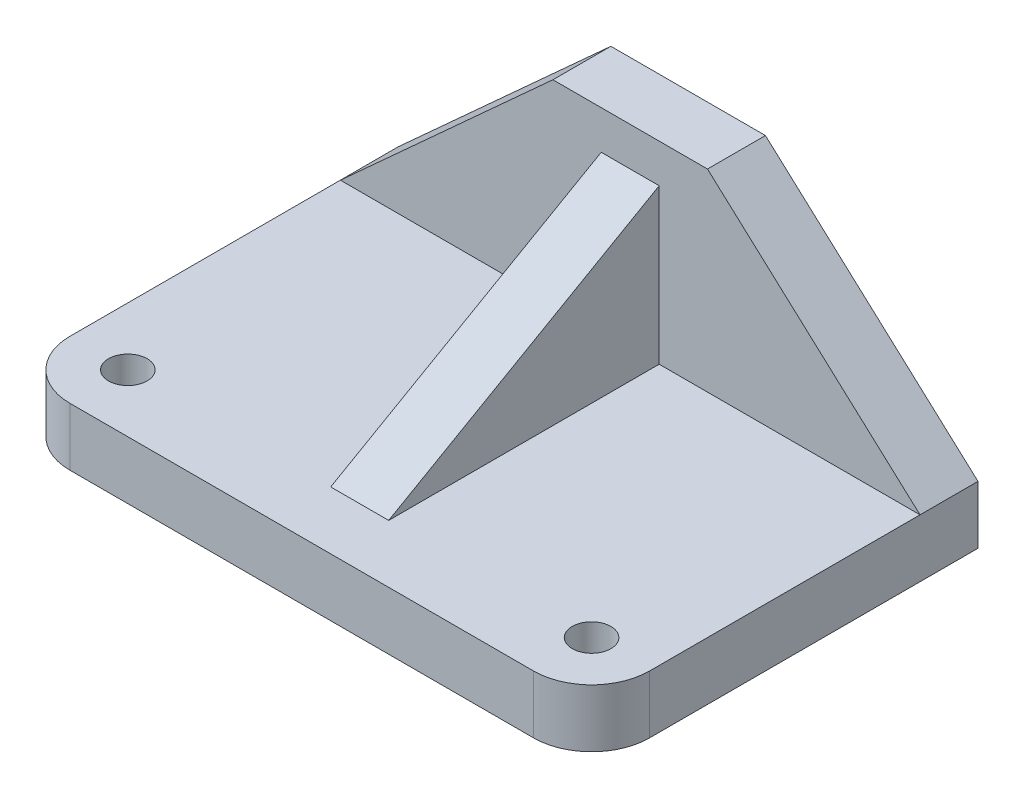
ISO-10303-21;
HEADER;
FILE_DESCRIPTION(('STEP AP214'),'2;1');
FILE_NAME('part.step','',(''),(''),'','','');
FILE_SCHEMA(('AUTOMOTIVE_DESIGN { 1 0 10303 214 1 1 1 1 }'));
ENDSEC;
DATA;
#1=APPLICATION_CONTEXT('core data for automotive mechanical design processes');
#2=APPLICATION_PROTOCOL_DEFINITION('international standard','automotive_design',2000,#1);
#3=PRODUCT_CONTEXT('',#1,'mechanical');
#4=PRODUCT('Part','Part','',(#3));
#5=PRODUCT_RELATED_PRODUCT_CATEGORY('part','',(#4));
#6=PRODUCT_DEFINITION_FORMATION('','',#4);
#7=PRODUCT_DEFINITION_CONTEXT('part definition',#1,'design');
#8=PRODUCT_DEFINITION('design','',#6,#7);
#9=PRODUCT_DEFINITION_SHAPE('','',#8);
#10=(LENGTH_UNIT() NAMED_UNIT(*) SI_UNIT(.MILLI.,.METRE.));
#11=(NAMED_UNIT(*) PLANE_ANGLE_UNIT() SI_UNIT($,.RADIAN.));
#12=(NAMED_UNIT(*) SI_UNIT($,.STERADIAN.) SOLID_ANGLE_UNIT());
#13=UNCERTAINTY_MEASURE_WITH_UNIT(LENGTH_MEASURE(1.E-05),#10,'distance_accuracy_value','');
#14=(GEOMETRIC_REPRESENTATION_CONTEXT(3) GLOBAL_UNCERTAINTY_ASSIGNED_CONTEXT((#13)) GLOBAL_UNIT_ASSIGNED_CONTEXT((#10,
#11,#12)) REPRESENTATION_CONTEXT('',''));
#15=CARTESIAN_POINT('',(0.,0.,0.));
#16=DIRECTION('',(0.,0.,1.));
#17=DIRECTION('',(1.,0.,0.));
#18=AXIS2_PLACEMENT_3D('',#15,#16,#17);
#19=CARTESIAN_POINT('',(0.,30.,0.));
#20=DIRECTION('',(0.,1.,0.));
#21=DIRECTION('',(0.,0.,1.));
#22=AXIS2_PLACEMENT_3D('',#19,#20,#21);
#23=PLANE('',#22);
#24=DIRECTION('',(0.,0.,-1.));
#25=VECTOR('',#24,1.);
#26=CARTESIAN_POINT('',(15.,30.,-70.0000000250001));
#27=LINE('',#26,#25);
#28=CARTESIAN_POINT('',(15.,30.,70.0000000250001));
#29=VERTEX_POINT('',#28);
#30=CARTESIAN_POINT('',(15.,30.,-70.0000000250001));
#31=VERTEX_POINT('',#30);
#32=EDGE_CURVE('E127',#29,#31,#27,.T.);
#33=ORIENTED_EDGE('',*,*,#32,.F.);
#34=DIRECTION('',(-1.,0.,0.));
#35=VECTOR('',#34,1.);
#36=CARTESIAN_POINT('',(15.,30.,70.0000000250001));
#37=LINE('',#36,#35);
#38=CARTESIAN_POINT('',(-15.,30.,70.0000000250001));
#39=VERTEX_POINT('',#38);
#40=EDGE_CURVE('E271',#29,#39,#37,.T.);
#41=ORIENTED_EDGE('',*,*,#40,.T.);
#42=DIRECTION('',(0.,0.,-1.));
#43=VECTOR('',#42,1.);
#44=CARTESIAN_POINT('',(-15.,30.,-70.0000000250001));
#45=LINE('',#44,#43);
#46=CARTESIAN_POINT('',(-15.,30.,-70.0000000250001));
#47=VERTEX_POINT('',#46);
#48=EDGE_CURVE('E278',#39,#47,#45,.T.);
#49=ORIENTED_EDGE('',*,*,#48,.T.);
#50=DIRECTION('',(-1.,0.,0.));
#51=VECTOR('',#50,1.);
#52=CARTESIAN_POINT('',(149.999999974,30.,-70.0000000250001));
#53=LINE('',#52,#51);
#54=CARTESIAN_POINT('',(-149.999999974,30.,-70.0000000250001));
#55=VERTEX_POINT('',#54);
#56=EDGE_CURVE('E62',#47,#55,#53,.T.);
#57=ORIENTED_EDGE('',*,*,#56,.T.);
#58=DIRECTION('',(0.,0.,1.));
#59=VECTOR('',#58,1.);
#60=CARTESIAN_POINT('',(-149.999999974,30.,-100.000000025));
#61=LINE('',#60,#59);
#62=CARTESIAN_POINT('',(-149.999999974,30.,70.0000000250001));
#63=VERTEX_POINT('',#62);
#64=EDGE_CURVE('E179',#55,#63,#61,.T.);
#65=ORIENTED_EDGE('',*,*,#64,.T.);
#66=CARTESIAN_POINT('',(-119.999999974,30.,70.0000000250001));
#67=DIRECTION('',(0.,1.,0.));
#68=DIRECTION('',(0.,0.,1.));
#69=AXIS2_PLACEMENT_3D('',#66,#67,#68);
#70=CIRCLE('',#69,30.);
#71=CARTESIAN_POINT('',(-119.999999974,30.,100.000000025));
#72=VERTEX_POINT('',#71);
#73=EDGE_CURVE('E209',#63,#72,#70,.T.);
#74=ORIENTED_EDGE('',*,*,#73,.T.);
#75=DIRECTION('',(1.,0.,0.));
#76=VECTOR('',#75,1.);
#77=CARTESIAN_POINT('',(-149.999999974,30.,100.000000025));
#78=LINE('',#77,#76);
#79=CARTESIAN_POINT('',(119.999999974,30.,100.000000025));
#80=VERTEX_POINT('',#79);
#81=EDGE_CURVE('E184',#72,#80,#78,.T.);
#82=ORIENTED_EDGE('',*,*,#81,.T.);
#83=CARTESIAN_POINT('',(119.999999974,30.,70.0000000250001));
#84=DIRECTION('',(0.,1.,0.));
#85=DIRECTION('',(0.,0.,1.));
#86=AXIS2_PLACEMENT_3D('',#83,#84,#85);
#87=CIRCLE('',#86,30.);
#88=CARTESIAN_POINT('',(149.999999974,30.,70.0000000250001));
#89=VERTEX_POINT('',#88);
#90=EDGE_CURVE('E47',#80,#89,#87,.T.);
#91=ORIENTED_EDGE('',*,*,#90,.T.);
#92=DIRECTION('',(0.,0.,-1.));
#93=VECTOR('',#92,1.);
#94=CARTESIAN_POINT('',(149.999999974,30.,-100.000000025));
#95=LINE('',#94,#93);
#96=CARTESIAN_POINT('',(149.999999974,30.,-70.0000000250001));
#97=VERTEX_POINT('',#96);
#98=EDGE_CURVE('E149',#89,#97,#95,.T.);
#99=ORIENTED_EDGE('',*,*,#98,.T.);
#100=EDGE_CURVE('E141',#97,#31,#53,.T.);
#101=ORIENTED_EDGE('',*,*,#100,.T.);
#102=EDGE_LOOP('',(#33,#41,#49,#57,#65,#74,#82,#91,#99,#101));
#103=FACE_BOUND('',#102,.T.);
#104=CARTESIAN_POINT('',(119.999999974,30.,70.0000000250001));
#105=DIRECTION('',(0.,-1.,0.));
#106=DIRECTION('',(0.,0.,-1.));
#107=AXIS2_PLACEMENT_3D('',#104,#105,#106);
#108=CIRCLE('',#107,10.);
#109=CARTESIAN_POINT('',(119.999999974,30.,60.0000000250001));
#110=VERTEX_POINT('',#109);
#111=EDGE_CURVE('E266',#110,#110,#108,.T.);
#112=ORIENTED_EDGE('',*,*,#111,.T.);
#113=EDGE_LOOP('',(#112));
#114=FACE_BOUND('',#113,.T.);
#115=CARTESIAN_POINT('',(-119.999999974,30.,70.0000000250001));
#116=DIRECTION('',(0.,1.,0.));
#117=DIRECTION('',(0.,0.,1.));
#118=AXIS2_PLACEMENT_3D('',#115,#116,#117);
#119=CIRCLE('',#118,10.);
#120=CARTESIAN_POINT('',(-119.999999974,30.,80.0000000250001));
#121=VERTEX_POINT('',#120);
#122=EDGE_CURVE('E166',#121,#121,#119,.T.);
#123=ORIENTED_EDGE('',*,*,#122,.F.);
#124=EDGE_LOOP('',(#123));
#125=FACE_BOUND('',#124,.T.);
#126=ADVANCED_FACE('F39',(#103,#114,#125),#23,.T.);
#127=CARTESIAN_POINT('',(0.,0.,0.));
#128=DIRECTION('',(0.,1.,0.));
#129=DIRECTION('',(0.,0.,1.));
#130=AXIS2_PLACEMENT_3D('',#127,#128,#129);
#131=PLANE('',#130);
#132=CARTESIAN_POINT('',(119.999999974,0.,70.0000000250001));
#133=DIRECTION('',(0.,-1.,0.));
#134=DIRECTION('',(0.,0.,-1.));
#135=AXIS2_PLACEMENT_3D('',#132,#133,#134);
#136=CIRCLE('',#135,10.);
#137=CARTESIAN_POINT('',(119.999999974,0.,60.0000000250001));
#138=VERTEX_POINT('',#137);
#139=EDGE_CURVE('E261',#138,#138,#136,.T.);
#140=ORIENTED_EDGE('',*,*,#139,.F.);
#141=EDGE_LOOP('',(#140));
#142=FACE_BOUND('',#141,.T.);
#143=DIRECTION('',(0.,0.,-1.));
#144=VECTOR('',#143,1.);
#145=CARTESIAN_POINT('',(149.999999974,0.,-100.000000025));
#146=LINE('',#145,#144);
#147=CARTESIAN_POINT('',(149.999999974,0.,70.0000000250001));
#148=VERTEX_POINT('',#147);
#149=CARTESIAN_POINT('',(149.999999974,0.,-100.000000025));
#150=VERTEX_POINT('',#149);
#151=EDGE_CURVE('E174',#148,#150,#146,.T.);
#152=ORIENTED_EDGE('',*,*,#151,.F.);
#153=CARTESIAN_POINT('',(119.999999974,0.,70.0000000250001));
#154=DIRECTION('',(0.,1.,0.));
#155=DIRECTION('',(0.,0.,1.));
#156=AXIS2_PLACEMENT_3D('',#153,#154,#155);
#157=CIRCLE('',#156,30.);
#158=CARTESIAN_POINT('',(119.999999974,0.,100.000000025));
#159=VERTEX_POINT('',#158);
#160=EDGE_CURVE('E11',#148,#159,#157,.F.);
#161=ORIENTED_EDGE('',*,*,#160,.T.);
#162=DIRECTION('',(1.,0.,0.));
#163=VECTOR('',#162,1.);
#164=CARTESIAN_POINT('',(-149.999999974,0.,100.000000025));
#165=LINE('',#164,#163);
#166=CARTESIAN_POINT('',(-119.999999974,0.,100.000000025));
#167=VERTEX_POINT('',#166);
#168=EDGE_CURVE('E180',#167,#159,#165,.T.);
#169=ORIENTED_EDGE('',*,*,#168,.F.);
#170=CARTESIAN_POINT('',(-119.999999974,0.,70.0000000250001));
#171=DIRECTION('',(0.,1.,0.));
#172=DIRECTION('',(0.,0.,1.));
#173=AXIS2_PLACEMENT_3D('',#170,#171,#172);
#174=CIRCLE('',#173,30.);
#175=CARTESIAN_POINT('',(-149.999999974,0.,70.0000000250001));
#176=VERTEX_POINT('',#175);
#177=EDGE_CURVE('E207',#167,#176,#174,.F.);
#178=ORIENTED_EDGE('',*,*,#177,.T.);
#179=DIRECTION('',(0.,0.,1.));
#180=VECTOR('',#179,1.);
#181=CARTESIAN_POINT('',(-149.999999974,0.,-100.000000025));
#182=LINE('',#181,#180);
#183=CARTESIAN_POINT('',(-149.999999974,0.,-100.000000025));
#184=VERTEX_POINT('',#183);
#185=EDGE_CURVE('E191',#184,#176,#182,.T.);
#186=ORIENTED_EDGE('',*,*,#185,.F.);
#187=DIRECTION('',(-1.,0.,0.));
#188=VECTOR('',#187,1.);
#189=CARTESIAN_POINT('',(-149.999999974,0.,-100.000000025));
#190=LINE('',#189,#188);
#191=EDGE_CURVE('E189',#150,#184,#190,.T.);
#192=ORIENTED_EDGE('',*,*,#191,.F.);
#193=EDGE_LOOP('',(#152,#161,#169,#178,#186,#192));
#194=FACE_BOUND('',#193,.T.);
#195=CARTESIAN_POINT('',(-119.999999974,0.,70.0000000250001));
#196=DIRECTION('',(0.,1.,0.));
#197=DIRECTION('',(0.,0.,1.));
#198=AXIS2_PLACEMENT_3D('',#195,#196,#197);
#199=CIRCLE('',#198,10.);
#200=CARTESIAN_POINT('',(-119.999999974,0.,80.0000000250001));
#201=VERTEX_POINT('',#200);
#202=EDGE_CURVE('E259',#201,#201,#199,.T.);
#203=ORIENTED_EDGE('',*,*,#202,.T.);
#204=EDGE_LOOP('',(#203));
#205=FACE_BOUND('',#204,.T.);
#206=ADVANCED_FACE('F250',(#142,#194,#205),#131,.F.);
#207=CARTESIAN_POINT('',(119.999999974,30.,70.0000000250001));
#208=DIRECTION('',(0.,-1.,0.));
#209=DIRECTION('',(0.,0.,-1.));
#210=AXIS2_PLACEMENT_3D('',#207,#208,#209);
#211=CYLINDRICAL_SURFACE('',#210,30.);
#212=DIRECTION('',(0.,-1.,0.));
#213=VECTOR('',#212,1.);
#214=CARTESIAN_POINT('',(149.999999974,30.,70.0000000250001));
#215=LINE('',#214,#213);
#216=EDGE_CURVE('E211',#89,#148,#215,.T.);
#217=ORIENTED_EDGE('',*,*,#216,.F.);
#218=ORIENTED_EDGE('',*,*,#90,.F.);
#219=DIRECTION('',(0.,-1.,0.));
#220=VECTOR('',#219,1.);
#221=CARTESIAN_POINT('',(119.999999974,30.,100.000000025));
#222=LINE('',#221,#220);
#223=EDGE_CURVE('E214',#159,#80,#222,.F.);
#224=ORIENTED_EDGE('',*,*,#223,.F.);
#225=ORIENTED_EDGE('',*,*,#160,.F.);
#226=EDGE_LOOP('',(#217,#218,#224,#225));
#227=FACE_BOUND('',#226,.T.);
#228=ADVANCED_FACE('F41',(#227),#211,.T.);
#229=CARTESIAN_POINT('',(-119.999999974,30.,70.0000000250001));
#230=DIRECTION('',(0.,1.,0.));
#231=DIRECTION('',(0.,0.,1.));
#232=AXIS2_PLACEMENT_3D('',#229,#230,#231);
#233=CYLINDRICAL_SURFACE('',#232,30.);
#234=DIRECTION('',(0.,1.,0.));
#235=VECTOR('',#234,1.);
#236=CARTESIAN_POINT('',(-149.999999974,30.,70.0000000250001));
#237=LINE('',#236,#235);
#238=EDGE_CURVE('E201',#176,#63,#237,.T.);
#239=ORIENTED_EDGE('',*,*,#238,.F.);
#240=ORIENTED_EDGE('',*,*,#177,.F.);
#241=DIRECTION('',(0.,1.,0.));
#242=VECTOR('',#241,1.);
#243=CARTESIAN_POINT('',(-119.999999974,30.,100.000000025));
#244=LINE('',#243,#242);
#245=EDGE_CURVE('E204',#72,#167,#244,.F.);
#246=ORIENTED_EDGE('',*,*,#245,.F.);
#247=ORIENTED_EDGE('',*,*,#73,.F.);
#248=EDGE_LOOP('',(#239,#240,#246,#247));
#249=FACE_BOUND('',#248,.T.);
#250=ADVANCED_FACE('F245',(#249),#233,.T.);
#251=CARTESIAN_POINT('',(149.999999974,30.,-100.000000025));
#252=DIRECTION('',(-1.,0.,0.));
#253=DIRECTION('',(0.,0.,1.));
#254=AXIS2_PLACEMENT_3D('',#251,#252,#253);
#255=PLANE('',#254);
#256=ORIENTED_EDGE('',*,*,#98,.F.);
#257=ORIENTED_EDGE('',*,*,#216,.T.);
#258=ORIENTED_EDGE('',*,*,#151,.T.);
#259=DIRECTION('',(0.,-1.,0.));
#260=VECTOR('',#259,1.);
#261=CARTESIAN_POINT('',(149.999999974,30.,-100.000000025));
#262=LINE('',#261,#260);
#263=CARTESIAN_POINT('',(149.999999974,30.,-100.000000025));
#264=VERTEX_POINT('',#263);
#265=EDGE_CURVE('E198',#264,#150,#262,.T.);
#266=ORIENTED_EDGE('',*,*,#265,.F.);
#267=DIRECTION('',(0.,0.,-1.));
#268=VECTOR('',#267,1.);
#269=CARTESIAN_POINT('',(149.999999974,30.,-70.0000000250001));
#270=LINE('',#269,#268);
#271=EDGE_CURVE('E161',#97,#264,#270,.T.);
#272=ORIENTED_EDGE('',*,*,#271,.F.);
#273=EDGE_LOOP('',(#256,#257,#258,#266,#272));
#274=FACE_BOUND('',#273,.T.);
#275=ADVANCED_FACE('F223',(#274),#255,.F.);
#276=CARTESIAN_POINT('',(-149.999999974,30.,-100.000000025));
#277=DIRECTION('',(0.,0.,1.));
#278=DIRECTION('',(1.,0.,0.));
#279=AXIS2_PLACEMENT_3D('',#276,#277,#278);
#280=PLANE('',#279);
#281=ORIENTED_EDGE('',*,*,#191,.T.);
#282=DIRECTION('',(0.,-1.,0.));
#283=VECTOR('',#282,1.);
#284=CARTESIAN_POINT('',(-149.999999974,30.,-100.000000025));
#285=LINE('',#284,#283);
#286=CARTESIAN_POINT('',(-149.999999974,30.,-100.000000025));
#287=VERTEX_POINT('',#286);
#288=EDGE_CURVE('E187',#287,#184,#285,.T.);
#289=ORIENTED_EDGE('',*,*,#288,.F.);
#290=DIRECTION('',(0.739940073316805,0.672672794083365,0.));
#291=VECTOR('',#290,1.);
#292=CARTESIAN_POINT('',(-40.,130.,-100.000000025));
#293=LINE('',#292,#291);
#294=CARTESIAN_POINT('',(-40.,130.,-100.000000025));
#295=VERTEX_POINT('',#294);
#296=EDGE_CURVE('E165',#287,#295,#293,.T.);
#297=ORIENTED_EDGE('',*,*,#296,.T.);
#298=DIRECTION('',(1.,0.,0.));
#299=VECTOR('',#298,1.);
#300=CARTESIAN_POINT('',(40.,130.,-100.000000025));
#301=LINE('',#300,#299);
#302=CARTESIAN_POINT('',(40.,130.,-100.000000025));
#303=VERTEX_POINT('',#302);
#304=EDGE_CURVE('E169',#295,#303,#301,.T.);
#305=ORIENTED_EDGE('',*,*,#304,.T.);
#306=DIRECTION('',(0.739940073316805,-0.672672794083365,0.));
#307=VECTOR('',#306,1.);
#308=CARTESIAN_POINT('',(149.999999974,30.,-100.000000025));
#309=LINE('',#308,#307);
#310=EDGE_CURVE('E162',#303,#264,#309,.T.);
#311=ORIENTED_EDGE('',*,*,#310,.T.);
#312=ORIENTED_EDGE('',*,*,#265,.T.);
#313=EDGE_LOOP('',(#281,#289,#297,#305,#311,#312));
#314=FACE_BOUND('',#313,.T.);
#315=ADVANCED_FACE('F229',(#314),#280,.F.);
#316=CARTESIAN_POINT('',(-149.999999974,30.,-100.000000025));
#317=DIRECTION('',(1.,0.,0.));
#318=DIRECTION('',(0.,0.,-1.));
#319=AXIS2_PLACEMENT_3D('',#316,#317,#318);
#320=PLANE('',#319);
#321=ORIENTED_EDGE('',*,*,#185,.T.);
#322=ORIENTED_EDGE('',*,*,#238,.T.);
#323=ORIENTED_EDGE('',*,*,#64,.F.);
#324=EDGE_CURVE('E181',#287,#55,#61,.T.);
#325=ORIENTED_EDGE('',*,*,#324,.F.);
#326=ORIENTED_EDGE('',*,*,#288,.T.);
#327=EDGE_LOOP('',(#321,#322,#323,#325,#326));
#328=FACE_BOUND('',#327,.T.);
#329=ADVANCED_FACE('F240',(#328),#320,.F.);
#330=CARTESIAN_POINT('',(-149.999999974,30.,100.000000025));
#331=DIRECTION('',(0.,0.,-1.));
#332=DIRECTION('',(-1.,0.,0.));
#333=AXIS2_PLACEMENT_3D('',#330,#331,#332);
#334=PLANE('',#333);
#335=ORIENTED_EDGE('',*,*,#168,.T.);
#336=ORIENTED_EDGE('',*,*,#223,.T.);
#337=ORIENTED_EDGE('',*,*,#81,.F.);
#338=ORIENTED_EDGE('',*,*,#245,.T.);
#339=EDGE_LOOP('',(#335,#336,#337,#338));
#340=FACE_BOUND('',#339,.T.);
#341=ADVANCED_FACE('F248',(#340),#334,.F.);
#342=CARTESIAN_POINT('',(149.999999974,30.,-70.0000000250001));
#343=DIRECTION('',(0.672672794083365,0.739940073316805,0.));
#344=DIRECTION('',(-0.739940073316805,0.672672794083365,0.));
#345=AXIS2_PLACEMENT_3D('',#342,#343,#344);
#346=PLANE('',#345);
#347=ORIENTED_EDGE('',*,*,#310,.F.);
#348=DIRECTION('',(0.,0.,-1.));
#349=VECTOR('',#348,1.);
#350=CARTESIAN_POINT('',(40.,130.,-70.0000000250001));
#351=LINE('',#350,#349);
#352=CARTESIAN_POINT('',(40.,130.,-70.0000000250001));
#353=VERTEX_POINT('',#352);
#354=EDGE_CURVE('E172',#353,#303,#351,.T.);
#355=ORIENTED_EDGE('',*,*,#354,.F.);
#356=DIRECTION('',(0.739940073316805,-0.672672794083365,0.));
#357=VECTOR('',#356,1.);
#358=CARTESIAN_POINT('',(149.999999974,30.,-70.0000000250001));
#359=LINE('',#358,#357);
#360=EDGE_CURVE('E155',#353,#97,#359,.T.);
#361=ORIENTED_EDGE('',*,*,#360,.T.);
#362=ORIENTED_EDGE('',*,*,#271,.T.);
#363=EDGE_LOOP('',(#347,#355,#361,#362));
#364=FACE_BOUND('',#363,.T.);
#365=ADVANCED_FACE('F227',(#364),#346,.T.);
#366=CARTESIAN_POINT('',(40.,130.,-70.0000000250001));
#367=DIRECTION('',(0.,1.,0.));
#368=DIRECTION('',(-1.,0.,0.));
#369=AXIS2_PLACEMENT_3D('',#366,#367,#368);
#370=PLANE('',#369);
#371=ORIENTED_EDGE('',*,*,#304,.F.);
#372=DIRECTION('',(0.,0.,-1.));
#373=VECTOR('',#372,1.);
#374=CARTESIAN_POINT('',(-40.,130.,-70.0000000250001));
#375=LINE('',#374,#373);
#376=CARTESIAN_POINT('',(-40.,130.,-70.0000000250001));
#377=VERTEX_POINT('',#376);
#378=EDGE_CURVE('E175',#377,#295,#375,.T.);
#379=ORIENTED_EDGE('',*,*,#378,.F.);
#380=DIRECTION('',(1.,0.,0.));
#381=VECTOR('',#380,1.);
#382=CARTESIAN_POINT('',(40.,130.,-70.0000000250001));
#383=LINE('',#382,#381);
#384=EDGE_CURVE('E153',#377,#353,#383,.T.);
#385=ORIENTED_EDGE('',*,*,#384,.T.);
#386=ORIENTED_EDGE('',*,*,#354,.T.);
#387=EDGE_LOOP('',(#371,#379,#385,#386));
#388=FACE_BOUND('',#387,.T.);
#389=ADVANCED_FACE('F233',(#388),#370,.T.);
#390=CARTESIAN_POINT('',(-40.,130.,-70.0000000250001));
#391=DIRECTION('',(-0.672672794083365,0.739940073316805,0.));
#392=DIRECTION('',(-0.739940073316805,-0.672672794083365,0.));
#393=AXIS2_PLACEMENT_3D('',#390,#391,#392);
#394=PLANE('',#393);
#395=ORIENTED_EDGE('',*,*,#296,.F.);
#396=ORIENTED_EDGE('',*,*,#324,.T.);
#397=DIRECTION('',(0.739940073316805,0.672672794083365,0.));
#398=VECTOR('',#397,1.);
#399=CARTESIAN_POINT('',(-40.,130.,-70.0000000250001));
#400=LINE('',#399,#398);
#401=EDGE_CURVE('E150',#55,#377,#400,.T.);
#402=ORIENTED_EDGE('',*,*,#401,.T.);
#403=ORIENTED_EDGE('',*,*,#378,.T.);
#404=EDGE_LOOP('',(#395,#396,#402,#403));
#405=FACE_BOUND('',#404,.T.);
#406=ADVANCED_FACE('F238',(#405),#394,.T.);
#407=CARTESIAN_POINT('',(0.,0.,-70.0000000250001));
#408=DIRECTION('',(0.,0.,1.));
#409=DIRECTION('',(1.,0.,0.));
#410=AXIS2_PLACEMENT_3D('',#407,#408,#409);
#411=PLANE('',#410);
#412=DIRECTION('',(0.,1.,0.));
#413=VECTOR('',#412,1.);
#414=CARTESIAN_POINT('',(15.,110.,-70.0000000250001));
#415=LINE('',#414,#413);
#416=CARTESIAN_POINT('',(15.,110.,-70.0000000250001));
#417=VERTEX_POINT('',#416);
#418=EDGE_CURVE('E130',#31,#417,#415,.T.);
#419=ORIENTED_EDGE('',*,*,#418,.F.);
#420=ORIENTED_EDGE('',*,*,#100,.F.);
#421=ORIENTED_EDGE('',*,*,#360,.F.);
#422=ORIENTED_EDGE('',*,*,#384,.F.);
#423=ORIENTED_EDGE('',*,*,#401,.F.);
#424=ORIENTED_EDGE('',*,*,#56,.F.);
#425=DIRECTION('',(0.,1.,0.));
#426=VECTOR('',#425,1.);
#427=CARTESIAN_POINT('',(-15.,110.,-70.0000000250001));
#428=LINE('',#427,#426);
#429=CARTESIAN_POINT('',(-15.,110.,-70.0000000250001));
#430=VERTEX_POINT('',#429);
#431=EDGE_CURVE('E276',#47,#430,#428,.T.);
#432=ORIENTED_EDGE('',*,*,#431,.T.);
#433=DIRECTION('',(-1.,0.,0.));
#434=VECTOR('',#433,1.);
#435=CARTESIAN_POINT('',(15.,110.,-70.0000000250001));
#436=LINE('',#435,#434);
#437=EDGE_CURVE('E144',#417,#430,#436,.T.);
#438=ORIENTED_EDGE('',*,*,#437,.F.);
#439=EDGE_LOOP('',(#419,#420,#421,#422,#423,#424,#432,#438));
#440=FACE_BOUND('',#439,.T.);
#441=ADVANCED_FACE('F139',(#440),#411,.T.);
#442=CARTESIAN_POINT('',(119.999999974,30.,70.0000000250001));
#443=DIRECTION('',(0.,-1.,0.));
#444=DIRECTION('',(0.,0.,-1.));
#445=AXIS2_PLACEMENT_3D('',#442,#443,#444);
#446=CYLINDRICAL_SURFACE('',#445,10.);
#447=ORIENTED_EDGE('',*,*,#111,.F.);
#448=EDGE_LOOP('',(#447));
#449=FACE_BOUND('',#448,.T.);
#450=ORIENTED_EDGE('',*,*,#139,.T.);
#451=EDGE_LOOP('',(#450));
#452=FACE_BOUND('',#451,.T.);
#453=ADVANCED_FACE('F326',(#449,#452),#446,.F.);
#454=CARTESIAN_POINT('',(-119.999999974,30.,70.0000000250001));
#455=DIRECTION('',(0.,-1.,0.));
#456=DIRECTION('',(0.,0.,-1.));
#457=AXIS2_PLACEMENT_3D('',#454,#455,#456);
#458=CYLINDRICAL_SURFACE('',#457,10.);
#459=ORIENTED_EDGE('',*,*,#122,.T.);
#460=EDGE_LOOP('',(#459));
#461=FACE_BOUND('',#460,.T.);
#462=ORIENTED_EDGE('',*,*,#202,.F.);
#463=EDGE_LOOP('',(#462));
#464=FACE_BOUND('',#463,.T.);
#465=ADVANCED_FACE('F331',(#461,#464),#458,.F.);
#466=CARTESIAN_POINT('',(15.,30.,70.0000000250001));
#467=DIRECTION('',(0.,-0.868243142200788,-0.496138938223257));
#468=DIRECTION('',(0.,0.496138938223258,-0.868243142200789));
#469=AXIS2_PLACEMENT_3D('',#466,#467,#468);
#470=PLANE('',#469);
#471=DIRECTION('',(0.,-0.496138938223257,0.868243142200789));
#472=VECTOR('',#471,1.);
#473=CARTESIAN_POINT('',(-15.,30.,70.0000000250001));
#474=LINE('',#473,#472);
#475=EDGE_CURVE('E54',#430,#39,#474,.T.);
#476=ORIENTED_EDGE('',*,*,#475,.T.);
#477=ORIENTED_EDGE('',*,*,#40,.F.);
#478=DIRECTION('',(0.,-0.496138938223257,0.868243142200789));
#479=VECTOR('',#478,1.);
#480=CARTESIAN_POINT('',(15.,30.,70.0000000250001));
#481=LINE('',#480,#479);
#482=EDGE_CURVE('E132',#417,#29,#481,.T.);
#483=ORIENTED_EDGE('',*,*,#482,.F.);
#484=ORIENTED_EDGE('',*,*,#437,.T.);
#485=EDGE_LOOP('',(#476,#477,#483,#484));
#486=FACE_BOUND('',#485,.T.);
#487=ADVANCED_FACE('F286',(#486),#470,.F.);
#488=CARTESIAN_POINT('',(15.,0.,0.));
#489=DIRECTION('',(1.,0.,0.));
#490=DIRECTION('',(0.,0.,-1.));
#491=AXIS2_PLACEMENT_3D('',#488,#489,#490);
#492=PLANE('',#491);
#493=ORIENTED_EDGE('',*,*,#32,.T.);
#494=ORIENTED_EDGE('',*,*,#418,.T.);
#495=ORIENTED_EDGE('',*,*,#482,.T.);
#496=EDGE_LOOP('',(#493,#494,#495));
#497=FACE_BOUND('',#496,.T.);
#498=ADVANCED_FACE('F129',(#497),#492,.T.);
#499=CARTESIAN_POINT('',(-15.,0.,0.));
#500=DIRECTION('',(1.,0.,0.));
#501=DIRECTION('',(0.,0.,-1.));
#502=AXIS2_PLACEMENT_3D('',#499,#500,#501);
#503=PLANE('',#502);
#504=ORIENTED_EDGE('',*,*,#48,.F.);
#505=ORIENTED_EDGE('',*,*,#475,.F.);
#506=ORIENTED_EDGE('',*,*,#431,.F.);
#507=EDGE_LOOP('',(#504,#505,#506));
#508=FACE_BOUND('',#507,.T.);
#509=ADVANCED_FACE('F280',(#508),#503,.F.);
#510=CLOSED_SHELL('',(#126,#206,#228,#250,#275,#315,#329,#341,#365,#389,#406,#441,#453,#465,
#487,#498,#509));
#511=MANIFOLD_SOLID_BREP('B2',#510);
#512=ADVANCED_BREP_SHAPE_REPRESENTATION('',(#18,#511),#14);
#513=SHAPE_DEFINITION_REPRESENTATION(#9,#512);
ENDSEC;
END-ISO-10303-21;
